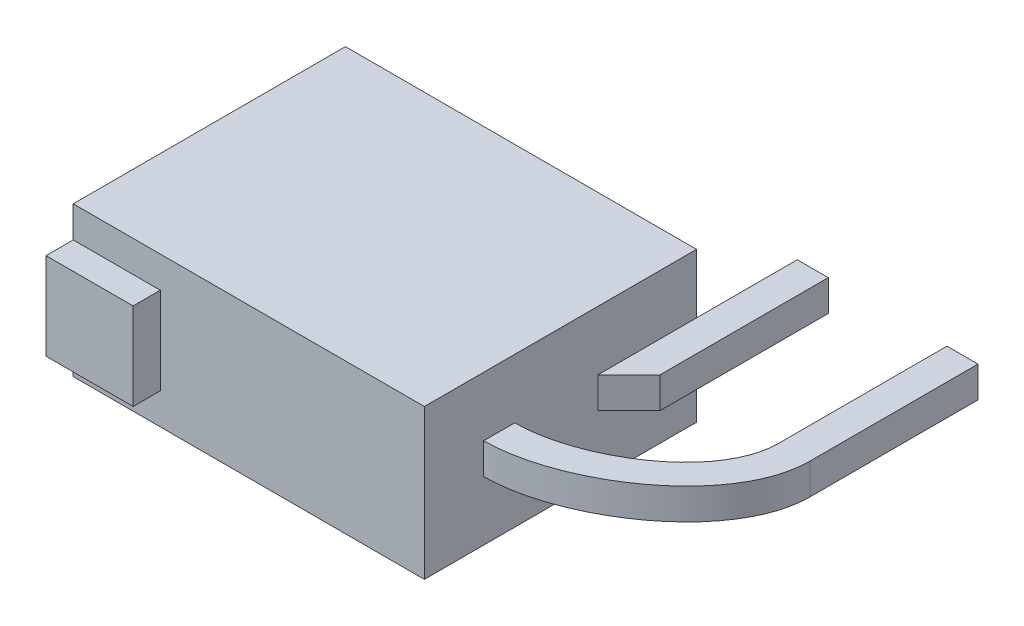
ISO-10303-21;
HEADER;
FILE_DESCRIPTION(('STEP AP214'),'2;1');
FILE_NAME('part.step','',(''),(''),'','','');
FILE_SCHEMA(('AUTOMOTIVE_DESIGN { 1 0 10303 214 1 1 1 1 }'));
ENDSEC;
DATA;
#1=APPLICATION_CONTEXT('core data for automotive mechanical design processes');
#2=APPLICATION_PROTOCOL_DEFINITION('international standard','automotive_design',2000,#1);
#3=PRODUCT_CONTEXT('',#1,'mechanical');
#4=PRODUCT('Part','Part','',(#3));
#5=PRODUCT_RELATED_PRODUCT_CATEGORY('part','',(#4));
#6=PRODUCT_DEFINITION_FORMATION('','',#4);
#7=PRODUCT_DEFINITION_CONTEXT('part definition',#1,'design');
#8=PRODUCT_DEFINITION('design','',#6,#7);
#9=PRODUCT_DEFINITION_SHAPE('','',#8);
#10=(LENGTH_UNIT() NAMED_UNIT(*) SI_UNIT(.MILLI.,.METRE.));
#11=(NAMED_UNIT(*) PLANE_ANGLE_UNIT() SI_UNIT($,.RADIAN.));
#12=(NAMED_UNIT(*) SI_UNIT($,.STERADIAN.) SOLID_ANGLE_UNIT());
#13=UNCERTAINTY_MEASURE_WITH_UNIT(LENGTH_MEASURE(1.E-05),#10,'distance_accuracy_value','');
#14=(GEOMETRIC_REPRESENTATION_CONTEXT(3) GLOBAL_UNCERTAINTY_ASSIGNED_CONTEXT((#13)) GLOBAL_UNIT_ASSIGNED_CONTEXT((#10,
#11,#12)) REPRESENTATION_CONTEXT('',''));
#15=CARTESIAN_POINT('',(0.,0.,0.));
#16=DIRECTION('',(0.,0.,1.));
#17=DIRECTION('',(1.,0.,0.));
#18=AXIS2_PLACEMENT_3D('',#15,#16,#17);
#19=CARTESIAN_POINT('',(14.5122034611053,0.570000000000003,3.62));
#20=DIRECTION('',(0.,0.,1.));
#21=DIRECTION('',(0.,-1.,0.));
#22=AXIS2_PLACEMENT_3D('',#19,#20,#21);
#23=PLANE('',#22);
#24=DIRECTION('',(0.,1.,0.));
#25=VECTOR('',#24,1.);
#26=CARTESIAN_POINT('',(12.9,0.,3.62));
#27=LINE('',#26,#25);
#28=CARTESIAN_POINT('',(12.9,0.570000000000002,3.62));
#29=VERTEX_POINT('',#28);
#30=CARTESIAN_POINT('',(12.9,-0.569999999999998,3.62));
#31=VERTEX_POINT('',#30);
#32=EDGE_CURVE('E13',#29,#31,#27,.F.);
#33=ORIENTED_EDGE('',*,*,#32,.F.);
#34=DIRECTION('',(-1.,0.,0.));
#35=VECTOR('',#34,1.);
#36=CARTESIAN_POINT('',(14.5122034611053,0.570000000000003,3.62));
#37=LINE('',#36,#35);
#38=CARTESIAN_POINT('',(2.,0.57,3.62));
#39=VERTEX_POINT('',#38);
#40=EDGE_CURVE('E164',#29,#39,#37,.T.);
#41=ORIENTED_EDGE('',*,*,#40,.T.);
#42=DIRECTION('',(0.,1.,0.));
#43=VECTOR('',#42,1.);
#44=CARTESIAN_POINT('',(2.,0.57,3.62));
#45=LINE('',#44,#43);
#46=CARTESIAN_POINT('',(2.,-0.57,3.62));
#47=VERTEX_POINT('',#46);
#48=EDGE_CURVE('E221',#47,#39,#45,.T.);
#49=ORIENTED_EDGE('',*,*,#48,.F.);
#50=DIRECTION('',(-1.,0.,0.));
#51=VECTOR('',#50,1.);
#52=CARTESIAN_POINT('',(14.5122034611053,-0.569999999999998,3.62));
#53=LINE('',#52,#51);
#54=EDGE_CURVE('E109',#31,#47,#53,.T.);
#55=ORIENTED_EDGE('',*,*,#54,.F.);
#56=EDGE_LOOP('',(#33,#41,#49,#55));
#57=FACE_BOUND('',#56,.T.);
#58=ADVANCED_FACE('F99',(#57),#23,.T.);
#59=CARTESIAN_POINT('',(14.5122034611053,-0.569999999999998,2.48));
#60=DIRECTION('',(0.,-1.,0.));
#61=DIRECTION('',(1.,0.,0.));
#62=AXIS2_PLACEMENT_3D('',#59,#60,#61);
#63=PLANE('',#62);
#64=DIRECTION('',(-1.,0.,0.));
#65=VECTOR('',#64,1.);
#66=CARTESIAN_POINT('',(14.5122034611053,-0.569999999999998,2.48));
#67=LINE('',#66,#65);
#68=CARTESIAN_POINT('',(12.9,-0.569999999999999,2.48));
#69=VERTEX_POINT('',#68);
#70=CARTESIAN_POINT('',(2.,-0.57,2.48));
#71=VERTEX_POINT('',#70);
#72=EDGE_CURVE('E163',#69,#71,#67,.T.);
#73=ORIENTED_EDGE('',*,*,#72,.F.);
#74=DIRECTION('',(0.,0.,1.));
#75=VECTOR('',#74,1.);
#76=CARTESIAN_POINT('',(12.9,-0.57,-3.7));
#77=LINE('',#76,#75);
#78=CARTESIAN_POINT('',(12.9,-0.57,-3.7));
#79=VERTEX_POINT('',#78);
#80=EDGE_CURVE('E175',#79,#69,#77,.T.);
#81=ORIENTED_EDGE('',*,*,#80,.F.);
#82=DIRECTION('',(1.,0.,0.));
#83=VECTOR('',#82,1.);
#84=CARTESIAN_POINT('',(12.9,-0.57,-3.7));
#85=LINE('',#84,#83);
#86=CARTESIAN_POINT('',(14.04,-0.57,-3.7));
#87=VERTEX_POINT('',#86);
#88=EDGE_CURVE('E198',#79,#87,#85,.T.);
#89=ORIENTED_EDGE('',*,*,#88,.T.);
#90=DIRECTION('',(0.,0.,1.));
#91=VECTOR('',#90,1.);
#92=CARTESIAN_POINT('',(14.04,-0.57,-3.7));
#93=LINE('',#92,#91);
#94=CARTESIAN_POINT('',(14.04,-0.57,2.48));
#95=VERTEX_POINT('',#94);
#96=EDGE_CURVE('E212',#87,#95,#93,.T.);
#97=ORIENTED_EDGE('',*,*,#96,.T.);
#98=DIRECTION('',(0.707106781186547,0.,-0.707106781186548));
#99=VECTOR('',#98,1.);
#100=CARTESIAN_POINT('',(12.9,-0.569999999999998,3.62));
#101=LINE('',#100,#99);
#102=EDGE_CURVE('E211',#31,#95,#101,.T.);
#103=ORIENTED_EDGE('',*,*,#102,.F.);
#104=ORIENTED_EDGE('',*,*,#54,.T.);
#105=DIRECTION('',(0.,0.,1.));
#106=VECTOR('',#105,1.);
#107=CARTESIAN_POINT('',(2.,-0.57,2.48));
#108=LINE('',#107,#106);
#109=EDGE_CURVE('E237',#71,#47,#108,.T.);
#110=ORIENTED_EDGE('',*,*,#109,.F.);
#111=EDGE_LOOP('',(#73,#81,#89,#97,#103,#104,#110));
#112=FACE_BOUND('',#111,.T.);
#113=ADVANCED_FACE('F274',(#112),#63,.T.);
#114=CARTESIAN_POINT('',(14.5122034611053,0.570000000000003,2.48));
#115=DIRECTION('',(0.,0.,-1.));
#116=DIRECTION('',(-1.,0.,0.));
#117=AXIS2_PLACEMENT_3D('',#114,#115,#116);
#118=PLANE('',#117);
#119=DIRECTION('',(0.,1.,0.));
#120=VECTOR('',#119,1.);
#121=CARTESIAN_POINT('',(12.9,-0.57,2.48));
#122=LINE('',#121,#120);
#123=CARTESIAN_POINT('',(12.9,0.57,2.48));
#124=VERTEX_POINT('',#123);
#125=EDGE_CURVE('E116',#69,#124,#122,.T.);
#126=ORIENTED_EDGE('',*,*,#125,.F.);
#127=ORIENTED_EDGE('',*,*,#72,.T.);
#128=DIRECTION('',(0.,-1.,0.));
#129=VECTOR('',#128,1.);
#130=CARTESIAN_POINT('',(2.,0.57,2.48));
#131=LINE('',#130,#129);
#132=CARTESIAN_POINT('',(2.,0.57,2.48));
#133=VERTEX_POINT('',#132);
#134=EDGE_CURVE('E158',#133,#71,#131,.T.);
#135=ORIENTED_EDGE('',*,*,#134,.F.);
#136=DIRECTION('',(-1.,0.,0.));
#137=VECTOR('',#136,1.);
#138=CARTESIAN_POINT('',(14.5122034611053,0.570000000000003,2.48));
#139=LINE('',#138,#137);
#140=EDGE_CURVE('E154',#124,#133,#139,.T.);
#141=ORIENTED_EDGE('',*,*,#140,.F.);
#142=EDGE_LOOP('',(#126,#127,#135,#141));
#143=FACE_BOUND('',#142,.T.);
#144=ADVANCED_FACE('F156',(#143),#118,.T.);
#145=CARTESIAN_POINT('',(14.5122034611053,0.570000000000003,2.48));
#146=DIRECTION('',(0.,1.,0.));
#147=DIRECTION('',(-1.,0.,0.));
#148=AXIS2_PLACEMENT_3D('',#145,#146,#147);
#149=PLANE('',#148);
#150=ORIENTED_EDGE('',*,*,#40,.F.);
#151=DIRECTION('',(0.707106781186548,0.,-0.707106781186547));
#152=VECTOR('',#151,1.);
#153=CARTESIAN_POINT('',(13.47,0.570000000000001,3.05));
#154=LINE('',#153,#152);
#155=CARTESIAN_POINT('',(14.04,0.57,2.48));
#156=VERTEX_POINT('',#155);
#157=EDGE_CURVE('E207',#29,#156,#154,.T.);
#158=ORIENTED_EDGE('',*,*,#157,.T.);
#159=DIRECTION('',(0.,0.,1.));
#160=VECTOR('',#159,1.);
#161=CARTESIAN_POINT('',(14.04,0.57,-3.7));
#162=LINE('',#161,#160);
#163=CARTESIAN_POINT('',(14.04,0.57,-3.7));
#164=VERTEX_POINT('',#163);
#165=EDGE_CURVE('E176',#164,#156,#162,.T.);
#166=ORIENTED_EDGE('',*,*,#165,.F.);
#167=DIRECTION('',(-1.,0.,0.));
#168=VECTOR('',#167,1.);
#169=CARTESIAN_POINT('',(12.9,0.57,-3.7));
#170=LINE('',#169,#168);
#171=CARTESIAN_POINT('',(12.9,0.57,-3.7));
#172=VERTEX_POINT('',#171);
#173=EDGE_CURVE('E170',#164,#172,#170,.T.);
#174=ORIENTED_EDGE('',*,*,#173,.T.);
#175=DIRECTION('',(0.,0.,1.));
#176=VECTOR('',#175,1.);
#177=CARTESIAN_POINT('',(12.9,0.57,-3.7));
#178=LINE('',#177,#176);
#179=EDGE_CURVE('E167',#172,#124,#178,.T.);
#180=ORIENTED_EDGE('',*,*,#179,.T.);
#181=ORIENTED_EDGE('',*,*,#140,.T.);
#182=DIRECTION('',(0.,0.,-1.));
#183=VECTOR('',#182,1.);
#184=CARTESIAN_POINT('',(2.,0.57,2.48));
#185=LINE('',#184,#183);
#186=EDGE_CURVE('E232',#39,#133,#185,.T.);
#187=ORIENTED_EDGE('',*,*,#186,.F.);
#188=EDGE_LOOP('',(#150,#158,#166,#174,#180,#181,#187));
#189=FACE_BOUND('',#188,.T.);
#190=ADVANCED_FACE('F168',(#189),#149,.T.);
#191=CARTESIAN_POINT('',(2.,0.,-4.2));
#192=DIRECTION('',(-1.,0.,0.));
#193=DIRECTION('',(0.,0.,1.));
#194=AXIS2_PLACEMENT_3D('',#191,#192,#193);
#195=PLANE('',#194);
#196=ORIENTED_EDGE('',*,*,#48,.T.);
#197=ORIENTED_EDGE('',*,*,#186,.T.);
#198=ORIENTED_EDGE('',*,*,#134,.T.);
#199=ORIENTED_EDGE('',*,*,#109,.T.);
#200=EDGE_LOOP('',(#196,#197,#198,#199));
#201=FACE_BOUND('',#200,.T.);
#202=ADVANCED_FACE('F271',(#201),#195,.T.);
#203=CARTESIAN_POINT('',(8.26000000000001,0.,8.26));
#204=DIRECTION('',(-0.707106781186548,0.,-0.707106781186547));
#205=DIRECTION('',(-0.707106781186547,0.,0.707106781186548));
#206=AXIS2_PLACEMENT_3D('',#203,#204,#205);
#207=PLANE('',#206);
#208=ORIENTED_EDGE('',*,*,#102,.T.);
#209=DIRECTION('',(0.,-1.,0.));
#210=VECTOR('',#209,1.);
#211=CARTESIAN_POINT('',(14.04,-0.57,2.48));
#212=LINE('',#211,#210);
#213=EDGE_CURVE('E217',#156,#95,#212,.T.);
#214=ORIENTED_EDGE('',*,*,#213,.F.);
#215=ORIENTED_EDGE('',*,*,#157,.F.);
#216=ORIENTED_EDGE('',*,*,#32,.T.);
#217=EDGE_LOOP('',(#208,#214,#215,#216));
#218=FACE_BOUND('',#217,.T.);
#219=ADVANCED_FACE('F289',(#218),#207,.F.);
#220=CARTESIAN_POINT('',(14.04,-0.57,-3.7));
#221=DIRECTION('',(1.,0.,0.));
#222=DIRECTION('',(0.,0.,-1.));
#223=AXIS2_PLACEMENT_3D('',#220,#221,#222);
#224=PLANE('',#223);
#225=ORIENTED_EDGE('',*,*,#165,.T.);
#226=ORIENTED_EDGE('',*,*,#213,.T.);
#227=ORIENTED_EDGE('',*,*,#96,.F.);
#228=DIRECTION('',(0.,1.,0.));
#229=VECTOR('',#228,1.);
#230=CARTESIAN_POINT('',(14.04,-0.57,-3.7));
#231=LINE('',#230,#229);
#232=EDGE_CURVE('E181',#87,#164,#231,.T.);
#233=ORIENTED_EDGE('',*,*,#232,.T.);
#234=EDGE_LOOP('',(#225,#226,#227,#233));
#235=FACE_BOUND('',#234,.T.);
#236=ADVANCED_FACE('F293',(#235),#224,.T.);
#237=CARTESIAN_POINT('',(12.9,-0.57,-3.7));
#238=DIRECTION('',(-1.,0.,0.));
#239=DIRECTION('',(0.,0.,1.));
#240=AXIS2_PLACEMENT_3D('',#237,#238,#239);
#241=PLANE('',#240);
#242=ORIENTED_EDGE('',*,*,#80,.T.);
#243=ORIENTED_EDGE('',*,*,#125,.T.);
#244=ORIENTED_EDGE('',*,*,#179,.F.);
#245=DIRECTION('',(0.,-1.,0.));
#246=VECTOR('',#245,1.);
#247=CARTESIAN_POINT('',(12.9,-0.57,-3.7));
#248=LINE('',#247,#246);
#249=EDGE_CURVE('E195',#172,#79,#248,.T.);
#250=ORIENTED_EDGE('',*,*,#249,.T.);
#251=EDGE_LOOP('',(#242,#243,#244,#250));
#252=FACE_BOUND('',#251,.T.);
#253=ADVANCED_FACE('F179',(#252),#241,.T.);
#254=CARTESIAN_POINT('',(0.,0.,-3.7));
#255=DIRECTION('',(0.,0.,-1.));
#256=DIRECTION('',(-1.,0.,0.));
#257=AXIS2_PLACEMENT_3D('',#254,#255,#256);
#258=PLANE('',#257);
#259=ORIENTED_EDGE('',*,*,#232,.F.);
#260=ORIENTED_EDGE('',*,*,#88,.F.);
#261=ORIENTED_EDGE('',*,*,#249,.F.);
#262=ORIENTED_EDGE('',*,*,#173,.F.);
#263=EDGE_LOOP('',(#259,#260,#261,#262));
#264=FACE_BOUND('',#263,.T.);
#265=ADVANCED_FACE('F332',(#264),#258,.T.);
#266=CLOSED_SHELL('',(#58,#113,#144,#190,#202,#219,#236,#253,#265));
#267=MANIFOLD_SOLID_BREP('B2',#266);
#268=CARTESIAN_POINT('',(14.5122034611053,0.570000000000003,7.82));
#269=DIRECTION('',(0.,0.,1.));
#270=DIRECTION('',(0.,-1.,0.));
#271=AXIS2_PLACEMENT_3D('',#268,#269,#270);
#272=PLANE('',#271);
#273=DIRECTION('',(0.,-1.,0.));
#274=VECTOR('',#273,1.);
#275=CARTESIAN_POINT('',(12.9,0.570000000000003,7.82));
#276=LINE('',#275,#274);
#277=CARTESIAN_POINT('',(12.9,0.570000000000003,7.82));
#278=VERTEX_POINT('',#277);
#279=CARTESIAN_POINT('',(12.9,-0.569999999999997,7.82));
#280=VERTEX_POINT('',#279);
#281=EDGE_CURVE('E97',#278,#280,#276,.T.);
#282=ORIENTED_EDGE('',*,*,#281,.F.);
#283=DIRECTION('',(-1.,0.,0.));
#284=VECTOR('',#283,1.);
#285=CARTESIAN_POINT('',(14.5122034611053,0.570000000000003,7.82));
#286=LINE('',#285,#284);
#287=CARTESIAN_POINT('',(2.,0.57,7.82));
#288=VERTEX_POINT('',#287);
#289=EDGE_CURVE('E611',#278,#288,#286,.T.);
#290=ORIENTED_EDGE('',*,*,#289,.T.);
#291=DIRECTION('',(0.,1.,0.));
#292=VECTOR('',#291,1.);
#293=CARTESIAN_POINT('',(2.,0.57,7.82));
#294=LINE('',#293,#292);
#295=CARTESIAN_POINT('',(2.,-0.57,7.82));
#296=VERTEX_POINT('',#295);
#297=EDGE_CURVE('E589',#296,#288,#294,.T.);
#298=ORIENTED_EDGE('',*,*,#297,.F.);
#299=DIRECTION('',(-1.,0.,0.));
#300=VECTOR('',#299,1.);
#301=CARTESIAN_POINT('',(14.5122034611053,-0.569999999999998,7.82));
#302=LINE('',#301,#300);
#303=EDGE_CURVE('E620',#280,#296,#302,.T.);
#304=ORIENTED_EDGE('',*,*,#303,.F.);
#305=EDGE_LOOP('',(#282,#290,#298,#304));
#306=FACE_BOUND('',#305,.T.);
#307=ADVANCED_FACE('F455',(#306),#272,.T.);
#308=CARTESIAN_POINT('',(14.5122034611053,-0.569999999999998,6.68));
#309=DIRECTION('',(0.,-1.,0.));
#310=DIRECTION('',(1.,0.,0.));
#311=AXIS2_PLACEMENT_3D('',#308,#309,#310);
#312=PLANE('',#311);
#313=DIRECTION('',(-1.,0.,0.));
#314=VECTOR('',#313,1.);
#315=CARTESIAN_POINT('',(14.5122034611053,-0.569999999999998,6.68));
#316=LINE('',#315,#314);
#317=CARTESIAN_POINT('',(12.9,-0.569999999999997,6.68));
#318=VERTEX_POINT('',#317);
#319=CARTESIAN_POINT('',(2.,-0.57,6.68));
#320=VERTEX_POINT('',#319);
#321=EDGE_CURVE('E617',#318,#320,#316,.T.);
#322=ORIENTED_EDGE('',*,*,#321,.F.);
#323=CARTESIAN_POINT('',(12.9,-0.569999999999998,6.68));
#324=CARTESIAN_POINT('',(15.2067533702395,-0.569999999999997,6.68));
#325=CARTESIAN_POINT('',(18.4,-0.570000000000002,4.78675337023946));
#326=CARTESIAN_POINT('',(18.4,-0.570000000000002,2.48));
#327=B_SPLINE_CURVE_WITH_KNOTS('',3,(#323,#324,#325,#326),.UNSPECIFIED.,.F.,.F.,(4,4),(0.,1.),.UNSPECIFIED.);
#328=CARTESIAN_POINT('',(18.4,-0.570000000000002,2.48));
#329=VERTEX_POINT('',#328);
#330=EDGE_CURVE('E527',#318,#329,#327,.T.);
#331=ORIENTED_EDGE('',*,*,#330,.T.);
#332=DIRECTION('',(0.,0.,1.));
#333=VECTOR('',#332,1.);
#334=CARTESIAN_POINT('',(18.4,-0.570000000000002,-3.7));
#335=LINE('',#334,#333);
#336=CARTESIAN_POINT('',(18.4,-0.570000000000002,-3.7));
#337=VERTEX_POINT('',#336);
#338=EDGE_CURVE('E538',#337,#329,#335,.T.);
#339=ORIENTED_EDGE('',*,*,#338,.F.);
#340=DIRECTION('',(1.,0.,0.));
#341=VECTOR('',#340,1.);
#342=CARTESIAN_POINT('',(18.4,-0.570000000000002,-3.7));
#343=LINE('',#342,#341);
#344=CARTESIAN_POINT('',(19.54,-0.570000000000002,-3.7));
#345=VERTEX_POINT('',#344);
#346=EDGE_CURVE('E626',#337,#345,#343,.T.);
#347=ORIENTED_EDGE('',*,*,#346,.T.);
#348=DIRECTION('',(0.,0.,1.));
#349=VECTOR('',#348,1.);
#350=CARTESIAN_POINT('',(19.54,-0.570000000000002,-3.7));
#351=LINE('',#350,#349);
#352=CARTESIAN_POINT('',(19.54,-0.570000000000002,2.48));
#353=VERTEX_POINT('',#352);
#354=EDGE_CURVE('E632',#345,#353,#351,.T.);
#355=ORIENTED_EDGE('',*,*,#354,.T.);
#356=CARTESIAN_POINT('',(12.9,-0.569999999999998,7.82));
#357=CARTESIAN_POINT('',(15.7402895001116,-0.569999999999997,7.82));
#358=CARTESIAN_POINT('',(19.54,-0.570000000000002,5.32028950011164));
#359=CARTESIAN_POINT('',(19.54,-0.570000000000002,2.48));
#360=B_SPLINE_CURVE_WITH_KNOTS('',3,(#356,#357,#358,#359),.UNSPECIFIED.,.F.,.F.,(4,4),(0.,1.),.UNSPECIFIED.);
#361=EDGE_CURVE('E634',#353,#280,#360,.F.);
#362=ORIENTED_EDGE('',*,*,#361,.T.);
#363=ORIENTED_EDGE('',*,*,#303,.T.);
#364=DIRECTION('',(0.,0.,1.));
#365=VECTOR('',#364,1.);
#366=CARTESIAN_POINT('',(2.,-0.57,6.68));
#367=LINE('',#366,#365);
#368=EDGE_CURVE('E607',#320,#296,#367,.T.);
#369=ORIENTED_EDGE('',*,*,#368,.F.);
#370=EDGE_LOOP('',(#322,#331,#339,#347,#355,#362,#363,#369));
#371=FACE_BOUND('',#370,.T.);
#372=ADVANCED_FACE('F690',(#371),#312,.T.);
#373=CARTESIAN_POINT('',(14.5122034611053,0.570000000000003,6.68));
#374=DIRECTION('',(0.,0.,-1.));
#375=DIRECTION('',(-1.,0.,0.));
#376=AXIS2_PLACEMENT_3D('',#373,#374,#375);
#377=PLANE('',#376);
#378=DIRECTION('',(0.,1.,0.));
#379=VECTOR('',#378,1.);
#380=CARTESIAN_POINT('',(12.9,0.570000000000003,6.68));
#381=LINE('',#380,#379);
#382=CARTESIAN_POINT('',(12.9,0.570000000000003,6.68));
#383=VERTEX_POINT('',#382);
#384=EDGE_CURVE('E465',#318,#383,#381,.T.);
#385=ORIENTED_EDGE('',*,*,#384,.F.);
#386=ORIENTED_EDGE('',*,*,#321,.T.);
#387=DIRECTION('',(0.,-1.,0.));
#388=VECTOR('',#387,1.);
#389=CARTESIAN_POINT('',(2.,0.57,6.68));
#390=LINE('',#389,#388);
#391=CARTESIAN_POINT('',(2.,0.57,6.68));
#392=VERTEX_POINT('',#391);
#393=EDGE_CURVE('E603',#392,#320,#390,.T.);
#394=ORIENTED_EDGE('',*,*,#393,.F.);
#395=DIRECTION('',(-1.,0.,0.));
#396=VECTOR('',#395,1.);
#397=CARTESIAN_POINT('',(14.5122034611053,0.570000000000003,6.68));
#398=LINE('',#397,#396);
#399=EDGE_CURVE('E614',#383,#392,#398,.T.);
#400=ORIENTED_EDGE('',*,*,#399,.F.);
#401=EDGE_LOOP('',(#385,#386,#394,#400));
#402=FACE_BOUND('',#401,.T.);
#403=ADVANCED_FACE('F693',(#402),#377,.T.);
#404=CARTESIAN_POINT('',(14.5122034611053,0.570000000000003,6.68));
#405=DIRECTION('',(0.,1.,0.));
#406=DIRECTION('',(-1.,0.,0.));
#407=AXIS2_PLACEMENT_3D('',#404,#405,#406);
#408=PLANE('',#407);
#409=ORIENTED_EDGE('',*,*,#289,.F.);
#410=CARTESIAN_POINT('',(12.9,0.570000000000002,7.82));
#411=CARTESIAN_POINT('',(15.7402895001116,0.570000000000003,7.82));
#412=CARTESIAN_POINT('',(19.54,0.569999999999998,5.32028950011164));
#413=CARTESIAN_POINT('',(19.54,0.569999999999998,2.48));
#414=B_SPLINE_CURVE_WITH_KNOTS('',3,(#410,#411,#412,#413),.UNSPECIFIED.,.F.,.F.,(4,4),(0.,1.),.UNSPECIFIED.);
#415=CARTESIAN_POINT('',(19.54,0.569999999999998,2.48));
#416=VERTEX_POINT('',#415);
#417=EDGE_CURVE('E526',#278,#416,#414,.T.);
#418=ORIENTED_EDGE('',*,*,#417,.T.);
#419=DIRECTION('',(0.,0.,1.));
#420=VECTOR('',#419,1.);
#421=CARTESIAN_POINT('',(19.54,0.569999999999998,-3.7));
#422=LINE('',#421,#420);
#423=CARTESIAN_POINT('',(19.54,0.569999999999998,-3.7));
#424=VERTEX_POINT('',#423);
#425=EDGE_CURVE('E539',#424,#416,#422,.T.);
#426=ORIENTED_EDGE('',*,*,#425,.F.);
#427=DIRECTION('',(-1.,0.,0.));
#428=VECTOR('',#427,1.);
#429=CARTESIAN_POINT('',(18.4,0.569999999999998,-3.7));
#430=LINE('',#429,#428);
#431=CARTESIAN_POINT('',(18.4,0.569999999999998,-3.7));
#432=VERTEX_POINT('',#431);
#433=EDGE_CURVE('E533',#424,#432,#430,.T.);
#434=ORIENTED_EDGE('',*,*,#433,.T.);
#435=DIRECTION('',(0.,0.,1.));
#436=VECTOR('',#435,1.);
#437=CARTESIAN_POINT('',(18.4,0.569999999999998,-3.7));
#438=LINE('',#437,#436);
#439=CARTESIAN_POINT('',(18.4,0.569999999999998,2.48));
#440=VERTEX_POINT('',#439);
#441=EDGE_CURVE('E530',#432,#440,#438,.T.);
#442=ORIENTED_EDGE('',*,*,#441,.T.);
#443=CARTESIAN_POINT('',(12.9,0.570000000000002,6.68));
#444=CARTESIAN_POINT('',(15.2067533702395,0.570000000000003,6.68));
#445=CARTESIAN_POINT('',(18.4,0.569999999999998,4.78675337023946));
#446=CARTESIAN_POINT('',(18.4,0.569999999999998,2.48));
#447=B_SPLINE_CURVE_WITH_KNOTS('',3,(#443,#444,#445,#446),.UNSPECIFIED.,.F.,.F.,(4,4),(0.,1.),.UNSPECIFIED.);
#448=EDGE_CURVE('E516',#383,#440,#447,.T.);
#449=ORIENTED_EDGE('',*,*,#448,.F.);
#450=ORIENTED_EDGE('',*,*,#399,.T.);
#451=DIRECTION('',(0.,0.,-1.));
#452=VECTOR('',#451,1.);
#453=CARTESIAN_POINT('',(2.,0.57,6.68));
#454=LINE('',#453,#452);
#455=EDGE_CURVE('E599',#288,#392,#454,.T.);
#456=ORIENTED_EDGE('',*,*,#455,.F.);
#457=EDGE_LOOP('',(#409,#418,#426,#434,#442,#449,#450,#456));
#458=FACE_BOUND('',#457,.T.);
#459=ADVANCED_FACE('F531',(#458),#408,.T.);
#460=CARTESIAN_POINT('',(2.,0.,0.));
#461=DIRECTION('',(-1.,0.,0.));
#462=DIRECTION('',(0.,0.,1.));
#463=AXIS2_PLACEMENT_3D('',#460,#461,#462);
#464=PLANE('',#463);
#465=ORIENTED_EDGE('',*,*,#297,.T.);
#466=ORIENTED_EDGE('',*,*,#455,.T.);
#467=ORIENTED_EDGE('',*,*,#393,.T.);
#468=ORIENTED_EDGE('',*,*,#368,.T.);
#469=EDGE_LOOP('',(#465,#466,#467,#468));
#470=FACE_BOUND('',#469,.T.);
#471=ADVANCED_FACE('F681',(#470),#464,.T.);
#472=CARTESIAN_POINT('',(12.9,-0.569999999999999,6.68));
#473=CARTESIAN_POINT('',(15.2067533702395,-0.569999999999998,6.68));
#474=CARTESIAN_POINT('',(18.4,-0.570000000000002,4.78675337023946));
#475=CARTESIAN_POINT('',(18.4,-0.570000000000002,2.48));
#476=CARTESIAN_POINT('',(12.9,-0.189999999999998,6.68));
#477=CARTESIAN_POINT('',(15.2067533702395,-0.189999999999998,6.68));
#478=CARTESIAN_POINT('',(18.4,-0.190000000000002,4.78675337023946));
#479=CARTESIAN_POINT('',(18.4,-0.190000000000002,2.48));
#480=CARTESIAN_POINT('',(12.9,0.190000000000002,6.68));
#481=CARTESIAN_POINT('',(15.2067533702395,0.190000000000003,6.68));
#482=CARTESIAN_POINT('',(18.4,0.189999999999998,4.78675337023946));
#483=CARTESIAN_POINT('',(18.4,0.189999999999998,2.48));
#484=CARTESIAN_POINT('',(12.9,0.570000000000002,6.68));
#485=CARTESIAN_POINT('',(15.2067533702395,0.570000000000003,6.68));
#486=CARTESIAN_POINT('',(18.4,0.569999999999998,4.78675337023946));
#487=CARTESIAN_POINT('',(18.4,0.569999999999998,2.48));
#488=B_SPLINE_SURFACE_WITH_KNOTS('',3,3,((#472,#473,#474,#475),(#476,#477,#478,#479),(#480,#481,
#482,#483),(#484,#485,#486,#487)),.UNSPECIFIED.,.F.,.F.,.F.,(4,4),(4,4),(0.,1.),(0.,1.),.UNSPECIFIED.);
#489=DIRECTION('',(0.,1.,0.));
#490=VECTOR('',#489,1.);
#491=CARTESIAN_POINT('',(18.4,-0.570000000000002,2.48));
#492=LINE('',#491,#490);
#493=EDGE_CURVE('E521',#329,#440,#492,.T.);
#494=ORIENTED_EDGE('',*,*,#384,.T.);
#495=ORIENTED_EDGE('',*,*,#448,.T.);
#496=ORIENTED_EDGE('',*,*,#493,.F.);
#497=ORIENTED_EDGE('',*,*,#330,.F.);
#498=EDGE_LOOP('',(#494,#495,#496,#497));
#499=FACE_BOUND('',#498,.T.);
#500=ADVANCED_FACE('F518',(#499),#488,.T.);
#501=CARTESIAN_POINT('',(12.9,0.570000000000002,7.82));
#502=CARTESIAN_POINT('',(15.7402895001116,0.570000000000003,7.82));
#503=CARTESIAN_POINT('',(19.54,0.569999999999998,5.32028950011164));
#504=CARTESIAN_POINT('',(19.54,0.569999999999998,2.48));
#505=CARTESIAN_POINT('',(12.9,0.190000000000002,7.82));
#506=CARTESIAN_POINT('',(15.7402895001116,0.190000000000003,7.82));
#507=CARTESIAN_POINT('',(19.54,0.189999999999998,5.32028950011164));
#508=CARTESIAN_POINT('',(19.54,0.189999999999998,2.48));
#509=CARTESIAN_POINT('',(12.9,-0.189999999999998,7.82));
#510=CARTESIAN_POINT('',(15.7402895001116,-0.189999999999997,7.82));
#511=CARTESIAN_POINT('',(19.54,-0.190000000000002,5.32028950011164));
#512=CARTESIAN_POINT('',(19.54,-0.190000000000002,2.48));
#513=CARTESIAN_POINT('',(12.9,-0.569999999999998,7.82));
#514=CARTESIAN_POINT('',(15.7402895001116,-0.569999999999997,7.82));
#515=CARTESIAN_POINT('',(19.54,-0.570000000000002,5.32028950011164));
#516=CARTESIAN_POINT('',(19.54,-0.570000000000002,2.48));
#517=B_SPLINE_SURFACE_WITH_KNOTS('',3,3,((#501,#502,#503,#504),(#505,#506,#507,#508),(#509,#510,
#511,#512),(#513,#514,#515,#516)),.UNSPECIFIED.,.F.,.F.,.F.,(4,4),(4,4),(0.,1.),(0.,1.),.UNSPECIFIED.);
#518=DIRECTION('',(0.,-1.,0.));
#519=VECTOR('',#518,1.);
#520=CARTESIAN_POINT('',(19.54,-0.570000000000002,2.48));
#521=LINE('',#520,#519);
#522=EDGE_CURVE('E545',#416,#353,#521,.T.);
#523=ORIENTED_EDGE('',*,*,#281,.T.);
#524=ORIENTED_EDGE('',*,*,#361,.F.);
#525=ORIENTED_EDGE('',*,*,#522,.F.);
#526=ORIENTED_EDGE('',*,*,#417,.F.);
#527=EDGE_LOOP('',(#523,#524,#525,#526));
#528=FACE_BOUND('',#527,.T.);
#529=ADVANCED_FACE('F569',(#528),#517,.T.);
#530=CARTESIAN_POINT('',(19.54,-0.570000000000002,-3.7));
#531=DIRECTION('',(1.,0.,0.));
#532=DIRECTION('',(0.,0.,-1.));
#533=AXIS2_PLACEMENT_3D('',#530,#531,#532);
#534=PLANE('',#533);
#535=ORIENTED_EDGE('',*,*,#425,.T.);
#536=ORIENTED_EDGE('',*,*,#522,.T.);
#537=ORIENTED_EDGE('',*,*,#354,.F.);
#538=DIRECTION('',(0.,1.,0.));
#539=VECTOR('',#538,1.);
#540=CARTESIAN_POINT('',(19.54,-0.570000000000002,-3.7));
#541=LINE('',#540,#539);
#542=EDGE_CURVE('E630',#345,#424,#541,.T.);
#543=ORIENTED_EDGE('',*,*,#542,.T.);
#544=EDGE_LOOP('',(#535,#536,#537,#543));
#545=FACE_BOUND('',#544,.T.);
#546=ADVANCED_FACE('F565',(#545),#534,.T.);
#547=CARTESIAN_POINT('',(18.4,-0.570000000000002,-3.7));
#548=DIRECTION('',(-1.,0.,0.));
#549=DIRECTION('',(0.,0.,1.));
#550=AXIS2_PLACEMENT_3D('',#547,#548,#549);
#551=PLANE('',#550);
#552=ORIENTED_EDGE('',*,*,#338,.T.);
#553=ORIENTED_EDGE('',*,*,#493,.T.);
#554=ORIENTED_EDGE('',*,*,#441,.F.);
#555=DIRECTION('',(0.,-1.,0.));
#556=VECTOR('',#555,1.);
#557=CARTESIAN_POINT('',(18.4,-0.570000000000002,-3.7));
#558=LINE('',#557,#556);
#559=EDGE_CURVE('E625',#432,#337,#558,.T.);
#560=ORIENTED_EDGE('',*,*,#559,.T.);
#561=EDGE_LOOP('',(#552,#553,#554,#560));
#562=FACE_BOUND('',#561,.T.);
#563=ADVANCED_FACE('F543',(#562),#551,.T.);
#564=CARTESIAN_POINT('',(0.,0.,-3.7));
#565=DIRECTION('',(0.,0.,-1.));
#566=DIRECTION('',(-1.,0.,0.));
#567=AXIS2_PLACEMENT_3D('',#564,#565,#566);
#568=PLANE('',#567);
#569=ORIENTED_EDGE('',*,*,#542,.F.);
#570=ORIENTED_EDGE('',*,*,#346,.F.);
#571=ORIENTED_EDGE('',*,*,#559,.F.);
#572=ORIENTED_EDGE('',*,*,#433,.F.);
#573=EDGE_LOOP('',(#569,#570,#571,#572));
#574=FACE_BOUND('',#573,.T.);
#575=ADVANCED_FACE('F564',(#574),#568,.T.);
#576=CLOSED_SHELL('',(#307,#372,#403,#459,#471,#500,#529,#546,#563,#575));
#577=MANIFOLD_SOLID_BREP('B7',#576);
#578=CARTESIAN_POINT('',(0.,0.,10.));
#579=DIRECTION('',(0.,0.,-1.));
#580=DIRECTION('',(-1.,0.,0.));
#581=AXIS2_PLACEMENT_3D('',#578,#579,#580);
#582=PLANE('',#581);
#583=DIRECTION('',(-1.,0.,0.));
#584=VECTOR('',#583,1.);
#585=CARTESIAN_POINT('',(3.2,1.6,10.));
#586=LINE('',#585,#584);
#587=CARTESIAN_POINT('',(3.2,1.6,10.));
#588=VERTEX_POINT('',#587);
#589=CARTESIAN_POINT('',(0.,1.6,10.));
#590=VERTEX_POINT('',#589);
#591=EDGE_CURVE('E838',#588,#590,#586,.T.);
#592=ORIENTED_EDGE('',*,*,#591,.F.);
#593=DIRECTION('',(0.,1.,0.));
#594=VECTOR('',#593,1.);
#595=CARTESIAN_POINT('',(3.2,-1.6,10.));
#596=LINE('',#595,#594);
#597=CARTESIAN_POINT('',(3.2,-1.6,10.));
#598=VERTEX_POINT('',#597);
#599=EDGE_CURVE('E1111',#598,#588,#596,.T.);
#600=ORIENTED_EDGE('',*,*,#599,.F.);
#601=DIRECTION('',(1.,0.,0.));
#602=VECTOR('',#601,1.);
#603=CARTESIAN_POINT('',(3.2,-1.6,10.));
#604=LINE('',#603,#602);
#605=CARTESIAN_POINT('',(0.,-1.6,10.));
#606=VERTEX_POINT('',#605);
#607=EDGE_CURVE('E844',#606,#598,#604,.T.);
#608=ORIENTED_EDGE('',*,*,#607,.F.);
#609=DIRECTION('',(0.,-1.,0.));
#610=VECTOR('',#609,1.);
#611=CARTESIAN_POINT('',(0.,-2.75,10.));
#612=LINE('',#611,#610);
#613=CARTESIAN_POINT('',(0.,-2.75,10.));
#614=VERTEX_POINT('',#613);
#615=EDGE_CURVE('E959',#606,#614,#612,.T.);
#616=ORIENTED_EDGE('',*,*,#615,.T.);
#617=DIRECTION('',(1.,0.,0.));
#618=VECTOR('',#617,1.);
#619=CARTESIAN_POINT('',(0.,-2.75,10.));
#620=LINE('',#619,#618);
#621=CARTESIAN_POINT('',(12.9,-2.75,10.));
#622=VERTEX_POINT('',#621);
#623=EDGE_CURVE('E1060',#614,#622,#620,.T.);
#624=ORIENTED_EDGE('',*,*,#623,.T.);
#625=DIRECTION('',(0.,1.,0.));
#626=VECTOR('',#625,1.);
#627=CARTESIAN_POINT('',(12.9,-2.75,10.));
#628=LINE('',#627,#626);
#629=CARTESIAN_POINT('',(12.9,2.75,10.));
#630=VERTEX_POINT('',#629);
#631=EDGE_CURVE('E1063',#622,#630,#628,.T.);
#632=ORIENTED_EDGE('',*,*,#631,.T.);
#633=DIRECTION('',(-1.,0.,0.));
#634=VECTOR('',#633,1.);
#635=CARTESIAN_POINT('',(0.,2.75,10.));
#636=LINE('',#635,#634);
#637=CARTESIAN_POINT('',(0.,2.75,10.));
#638=VERTEX_POINT('',#637);
#639=EDGE_CURVE('E1066',#630,#638,#636,.T.);
#640=ORIENTED_EDGE('',*,*,#639,.T.);
#641=EDGE_CURVE('E1057',#638,#590,#612,.T.);
#642=ORIENTED_EDGE('',*,*,#641,.T.);
#643=EDGE_LOOP('',(#592,#600,#608,#616,#624,#632,#640,#642));
#644=FACE_BOUND('',#643,.T.);
#645=ADVANCED_FACE('F822',(#644),#582,.F.);
#646=CARTESIAN_POINT('',(0.,-2.75,10.));
#647=DIRECTION('',(1.,0.,0.));
#648=DIRECTION('',(0.,1.,0.));
#649=AXIS2_PLACEMENT_3D('',#646,#647,#648);
#650=PLANE('',#649);
#651=DIRECTION('',(0.,0.,1.));
#652=VECTOR('',#651,1.);
#653=CARTESIAN_POINT('',(0.,-1.9,1.15));
#654=LINE('',#653,#652);
#655=CARTESIAN_POINT('',(0.,-1.9,1.15));
#656=VERTEX_POINT('',#655);
#657=CARTESIAN_POINT('',(0.,-1.9,4.95));
#658=VERTEX_POINT('',#657);
#659=EDGE_CURVE('E965',#656,#658,#654,.T.);
#660=ORIENTED_EDGE('',*,*,#659,.F.);
#661=DIRECTION('',(0.,-1.,0.));
#662=VECTOR('',#661,1.);
#663=CARTESIAN_POINT('',(0.,1.9,1.15));
#664=LINE('',#663,#662);
#665=CARTESIAN_POINT('',(0.,1.9,1.15));
#666=VERTEX_POINT('',#665);
#667=EDGE_CURVE('E961',#666,#656,#664,.T.);
#668=ORIENTED_EDGE('',*,*,#667,.F.);
#669=DIRECTION('',(0.,0.,-1.));
#670=VECTOR('',#669,1.);
#671=CARTESIAN_POINT('',(0.,1.9,1.15));
#672=LINE('',#671,#670);
#673=CARTESIAN_POINT('',(0.,1.9,4.95));
#674=VERTEX_POINT('',#673);
#675=EDGE_CURVE('E977',#674,#666,#672,.T.);
#676=ORIENTED_EDGE('',*,*,#675,.F.);
#677=DIRECTION('',(0.,1.,0.));
#678=VECTOR('',#677,1.);
#679=CARTESIAN_POINT('',(0.,1.9,4.95));
#680=LINE('',#679,#678);
#681=EDGE_CURVE('E993',#658,#674,#680,.T.);
#682=ORIENTED_EDGE('',*,*,#681,.F.);
#683=EDGE_LOOP('',(#660,#668,#676,#682));
#684=FACE_BOUND('',#683,.T.);
#685=DIRECTION('',(0.,0.,1.));
#686=VECTOR('',#685,1.);
#687=CARTESIAN_POINT('',(0.,-1.9,5.35));
#688=LINE('',#687,#686);
#689=CARTESIAN_POINT('',(0.,-1.9,5.35));
#690=VERTEX_POINT('',#689);
#691=CARTESIAN_POINT('',(0.,-1.9,9.15));
#692=VERTEX_POINT('',#691);
#693=EDGE_CURVE('E1033',#690,#692,#688,.T.);
#694=ORIENTED_EDGE('',*,*,#693,.F.);
#695=DIRECTION('',(0.,-1.,0.));
#696=VECTOR('',#695,1.);
#697=CARTESIAN_POINT('',(0.,1.9,5.35));
#698=LINE('',#697,#696);
#699=CARTESIAN_POINT('',(0.,1.9,5.35));
#700=VERTEX_POINT('',#699);
#701=EDGE_CURVE('E1003',#700,#690,#698,.T.);
#702=ORIENTED_EDGE('',*,*,#701,.F.);
#703=DIRECTION('',(0.,0.,-1.));
#704=VECTOR('',#703,1.);
#705=CARTESIAN_POINT('',(0.,1.9,5.35));
#706=LINE('',#705,#704);
#707=CARTESIAN_POINT('',(0.,1.9,9.15));
#708=VERTEX_POINT('',#707);
#709=EDGE_CURVE('E1018',#708,#700,#706,.T.);
#710=ORIENTED_EDGE('',*,*,#709,.F.);
#711=DIRECTION('',(0.,1.,0.));
#712=VECTOR('',#711,1.);
#713=CARTESIAN_POINT('',(0.,1.9,9.15));
#714=LINE('',#713,#712);
#715=EDGE_CURVE('E1037',#692,#708,#714,.T.);
#716=ORIENTED_EDGE('',*,*,#715,.F.);
#717=EDGE_LOOP('',(#694,#702,#710,#716));
#718=FACE_BOUND('',#717,.T.);
#719=DIRECTION('',(0.,-1.,0.));
#720=VECTOR('',#719,1.);
#721=CARTESIAN_POINT('',(0.,-2.75,0.));
#722=LINE('',#721,#720);
#723=CARTESIAN_POINT('',(0.,2.75,0.));
#724=VERTEX_POINT('',#723);
#725=CARTESIAN_POINT('',(0.,-2.75,0.));
#726=VERTEX_POINT('',#725);
#727=EDGE_CURVE('E1047',#724,#726,#722,.T.);
#728=ORIENTED_EDGE('',*,*,#727,.T.);
#729=DIRECTION('',(0.,0.,-1.));
#730=VECTOR('',#729,1.);
#731=CARTESIAN_POINT('',(0.,-2.75,10.));
#732=LINE('',#731,#730);
#733=EDGE_CURVE('E453',#614,#726,#732,.T.);
#734=ORIENTED_EDGE('',*,*,#733,.F.);
#735=ORIENTED_EDGE('',*,*,#615,.F.);
#736=DIRECTION('',(0.,0.,-1.));
#737=VECTOR('',#736,1.);
#738=CARTESIAN_POINT('',(0.,-1.6,11.));
#739=LINE('',#738,#737);
#740=CARTESIAN_POINT('',(0.,-1.6,11.));
#741=VERTEX_POINT('',#740);
#742=EDGE_CURVE('E939',#741,#606,#739,.T.);
#743=ORIENTED_EDGE('',*,*,#742,.F.);
#744=DIRECTION('',(0.,-1.,0.));
#745=VECTOR('',#744,1.);
#746=CARTESIAN_POINT('',(0.,-1.6,11.));
#747=LINE('',#746,#745);
#748=CARTESIAN_POINT('',(0.,1.6,11.));
#749=VERTEX_POINT('',#748);
#750=EDGE_CURVE('E946',#749,#741,#747,.T.);
#751=ORIENTED_EDGE('',*,*,#750,.F.);
#752=DIRECTION('',(0.,0.,-1.));
#753=VECTOR('',#752,1.);
#754=CARTESIAN_POINT('',(0.,1.6,11.));
#755=LINE('',#754,#753);
#756=EDGE_CURVE('E1105',#749,#590,#755,.T.);
#757=ORIENTED_EDGE('',*,*,#756,.T.);
#758=ORIENTED_EDGE('',*,*,#641,.F.);
#759=DIRECTION('',(0.,0.,-1.));
#760=VECTOR('',#759,1.);
#761=CARTESIAN_POINT('',(0.,2.75,10.));
#762=LINE('',#761,#760);
#763=EDGE_CURVE('E1069',#638,#724,#762,.T.);
#764=ORIENTED_EDGE('',*,*,#763,.T.);
#765=EDGE_LOOP('',(#728,#734,#735,#743,#751,#757,#758,#764));
#766=FACE_BOUND('',#765,.T.);
#767=ADVANCED_FACE('F824',(#684,#718,#766),#650,.F.);
#768=CARTESIAN_POINT('',(0.,-2.75,10.));
#769=DIRECTION('',(0.,1.,0.));
#770=DIRECTION('',(-1.,0.,0.));
#771=AXIS2_PLACEMENT_3D('',#768,#769,#770);
#772=PLANE('',#771);
#773=DIRECTION('',(1.,0.,0.));
#774=VECTOR('',#773,1.);
#775=CARTESIAN_POINT('',(0.,-2.75,0.));
#776=LINE('',#775,#774);
#777=CARTESIAN_POINT('',(12.9,-2.75,0.));
#778=VERTEX_POINT('',#777);
#779=EDGE_CURVE('E1071',#726,#778,#776,.T.);
#780=ORIENTED_EDGE('',*,*,#779,.T.);
#781=DIRECTION('',(0.,0.,-1.));
#782=VECTOR('',#781,1.);
#783=CARTESIAN_POINT('',(12.9,-2.75,10.));
#784=LINE('',#783,#782);
#785=EDGE_CURVE('E831',#622,#778,#784,.T.);
#786=ORIENTED_EDGE('',*,*,#785,.F.);
#787=ORIENTED_EDGE('',*,*,#623,.F.);
#788=ORIENTED_EDGE('',*,*,#733,.T.);
#789=EDGE_LOOP('',(#780,#786,#787,#788));
#790=FACE_BOUND('',#789,.T.);
#791=ADVANCED_FACE('F1141',(#790),#772,.F.);
#792=CARTESIAN_POINT('',(12.9,-2.75,10.));
#793=DIRECTION('',(-1.,0.,0.));
#794=DIRECTION('',(0.,-1.,0.));
#795=AXIS2_PLACEMENT_3D('',#792,#793,#794);
#796=PLANE('',#795);
#797=DIRECTION('',(0.,1.,0.));
#798=VECTOR('',#797,1.);
#799=CARTESIAN_POINT('',(12.9,-2.75,0.));
#800=LINE('',#799,#798);
#801=CARTESIAN_POINT('',(12.9,2.75,0.));
#802=VERTEX_POINT('',#801);
#803=EDGE_CURVE('E1074',#778,#802,#800,.T.);
#804=ORIENTED_EDGE('',*,*,#803,.T.);
#805=DIRECTION('',(0.,0.,-1.));
#806=VECTOR('',#805,1.);
#807=CARTESIAN_POINT('',(12.9,2.75,10.));
#808=LINE('',#807,#806);
#809=EDGE_CURVE('E1083',#630,#802,#808,.T.);
#810=ORIENTED_EDGE('',*,*,#809,.F.);
#811=ORIENTED_EDGE('',*,*,#631,.F.);
#812=ORIENTED_EDGE('',*,*,#785,.T.);
#813=EDGE_LOOP('',(#804,#810,#811,#812));
#814=FACE_BOUND('',#813,.T.);
#815=ADVANCED_FACE('F1092',(#814),#796,.F.);
#816=CARTESIAN_POINT('',(0.,2.75,10.));
#817=DIRECTION('',(0.,-1.,0.));
#818=DIRECTION('',(0.,0.,-1.));
#819=AXIS2_PLACEMENT_3D('',#816,#817,#818);
#820=PLANE('',#819);
#821=DIRECTION('',(-1.,0.,0.));
#822=VECTOR('',#821,1.);
#823=CARTESIAN_POINT('',(0.,2.75,0.));
#824=LINE('',#823,#822);
#825=EDGE_CURVE('E1077',#802,#724,#824,.T.);
#826=ORIENTED_EDGE('',*,*,#825,.T.);
#827=ORIENTED_EDGE('',*,*,#763,.F.);
#828=ORIENTED_EDGE('',*,*,#639,.F.);
#829=ORIENTED_EDGE('',*,*,#809,.T.);
#830=EDGE_LOOP('',(#826,#827,#828,#829));
#831=FACE_BOUND('',#830,.T.);
#832=ADVANCED_FACE('F1102',(#831),#820,.F.);
#833=CARTESIAN_POINT('',(0.,0.,0.));
#834=DIRECTION('',(0.,0.,-1.));
#835=DIRECTION('',(-1.,0.,0.));
#836=AXIS2_PLACEMENT_3D('',#833,#834,#835);
#837=PLANE('',#836);
#838=ORIENTED_EDGE('',*,*,#727,.F.);
#839=ORIENTED_EDGE('',*,*,#825,.F.);
#840=ORIENTED_EDGE('',*,*,#803,.F.);
#841=ORIENTED_EDGE('',*,*,#779,.F.);
#842=EDGE_LOOP('',(#838,#839,#840,#841));
#843=FACE_BOUND('',#842,.T.);
#844=ADVANCED_FACE('F1099',(#843),#837,.T.);
#845=CARTESIAN_POINT('',(10.,1.9,5.35));
#846=DIRECTION('',(0.,0.,-1.));
#847=DIRECTION('',(-1.,0.,0.));
#848=AXIS2_PLACEMENT_3D('',#845,#846,#847);
#849=PLANE('',#848);
#850=ORIENTED_EDGE('',*,*,#701,.T.);
#851=DIRECTION('',(-1.,0.,0.));
#852=VECTOR('',#851,1.);
#853=CARTESIAN_POINT('',(10.,-1.9,5.35));
#854=LINE('',#853,#852);
#855=CARTESIAN_POINT('',(10.,-1.9,5.35));
#856=VERTEX_POINT('',#855);
#857=EDGE_CURVE('E1030',#856,#690,#854,.T.);
#858=ORIENTED_EDGE('',*,*,#857,.F.);
#859=DIRECTION('',(0.,-1.,0.));
#860=VECTOR('',#859,1.);
#861=CARTESIAN_POINT('',(10.,1.9,5.35));
#862=LINE('',#861,#860);
#863=CARTESIAN_POINT('',(10.,1.9,5.35));
#864=VERTEX_POINT('',#863);
#865=EDGE_CURVE('E1013',#864,#856,#862,.T.);
#866=ORIENTED_EDGE('',*,*,#865,.F.);
#867=DIRECTION('',(-1.,0.,0.));
#868=VECTOR('',#867,1.);
#869=CARTESIAN_POINT('',(10.,1.9,5.35));
#870=LINE('',#869,#868);
#871=EDGE_CURVE('E1044',#864,#700,#870,.T.);
#872=ORIENTED_EDGE('',*,*,#871,.T.);
#873=EDGE_LOOP('',(#850,#858,#866,#872));
#874=FACE_BOUND('',#873,.T.);
#875=ADVANCED_FACE('F1145',(#874),#849,.F.);
#876=CARTESIAN_POINT('',(10.,1.9,5.35));
#877=DIRECTION('',(0.,1.,0.));
#878=DIRECTION('',(0.,0.,1.));
#879=AXIS2_PLACEMENT_3D('',#876,#877,#878);
#880=PLANE('',#879);
#881=ORIENTED_EDGE('',*,*,#709,.T.);
#882=ORIENTED_EDGE('',*,*,#871,.F.);
#883=DIRECTION('',(0.,0.,-1.));
#884=VECTOR('',#883,1.);
#885=CARTESIAN_POINT('',(10.,1.9,5.35));
#886=LINE('',#885,#884);
#887=CARTESIAN_POINT('',(10.,1.9,9.15));
#888=VERTEX_POINT('',#887);
#889=EDGE_CURVE('E1026',#888,#864,#886,.T.);
#890=ORIENTED_EDGE('',*,*,#889,.F.);
#891=DIRECTION('',(-1.,0.,0.));
#892=VECTOR('',#891,1.);
#893=CARTESIAN_POINT('',(10.,1.9,9.15));
#894=LINE('',#893,#892);
#895=EDGE_CURVE('E1048',#888,#708,#894,.T.);
#896=ORIENTED_EDGE('',*,*,#895,.T.);
#897=EDGE_LOOP('',(#881,#882,#890,#896));
#898=FACE_BOUND('',#897,.T.);
#899=ADVANCED_FACE('F1171',(#898),#880,.F.);
#900=CARTESIAN_POINT('',(10.,1.9,9.15));
#901=DIRECTION('',(0.,0.,1.));
#902=DIRECTION('',(0.,-1.,0.));
#903=AXIS2_PLACEMENT_3D('',#900,#901,#902);
#904=PLANE('',#903);
#905=ORIENTED_EDGE('',*,*,#715,.T.);
#906=ORIENTED_EDGE('',*,*,#895,.F.);
#907=DIRECTION('',(0.,1.,0.));
#908=VECTOR('',#907,1.);
#909=CARTESIAN_POINT('',(10.,1.9,9.15));
#910=LINE('',#909,#908);
#911=CARTESIAN_POINT('',(10.,-1.9,9.15));
#912=VERTEX_POINT('',#911);
#913=EDGE_CURVE('E1022',#912,#888,#910,.T.);
#914=ORIENTED_EDGE('',*,*,#913,.F.);
#915=DIRECTION('',(-1.,0.,0.));
#916=VECTOR('',#915,1.);
#917=CARTESIAN_POINT('',(10.,-1.9,9.15));
#918=LINE('',#917,#916);
#919=EDGE_CURVE('E1051',#912,#692,#918,.T.);
#920=ORIENTED_EDGE('',*,*,#919,.T.);
#921=EDGE_LOOP('',(#905,#906,#914,#920));
#922=FACE_BOUND('',#921,.T.);
#923=ADVANCED_FACE('F1177',(#922),#904,.F.);
#924=CARTESIAN_POINT('',(10.,-1.9,5.35));
#925=DIRECTION('',(0.,-1.,0.));
#926=DIRECTION('',(1.,0.,0.));
#927=AXIS2_PLACEMENT_3D('',#924,#925,#926);
#928=PLANE('',#927);
#929=ORIENTED_EDGE('',*,*,#693,.T.);
#930=ORIENTED_EDGE('',*,*,#919,.F.);
#931=DIRECTION('',(0.,0.,1.));
#932=VECTOR('',#931,1.);
#933=CARTESIAN_POINT('',(10.,-1.9,5.35));
#934=LINE('',#933,#932);
#935=EDGE_CURVE('E1017',#856,#912,#934,.T.);
#936=ORIENTED_EDGE('',*,*,#935,.F.);
#937=ORIENTED_EDGE('',*,*,#857,.T.);
#938=EDGE_LOOP('',(#929,#930,#936,#937));
#939=FACE_BOUND('',#938,.T.);
#940=ADVANCED_FACE('F1184',(#939),#928,.F.);
#941=CARTESIAN_POINT('',(10.,0.,0.));
#942=DIRECTION('',(-1.,0.,0.));
#943=DIRECTION('',(0.,-1.,0.));
#944=AXIS2_PLACEMENT_3D('',#941,#942,#943);
#945=PLANE('',#944);
#946=ORIENTED_EDGE('',*,*,#865,.T.);
#947=ORIENTED_EDGE('',*,*,#935,.T.);
#948=ORIENTED_EDGE('',*,*,#913,.T.);
#949=ORIENTED_EDGE('',*,*,#889,.T.);
#950=EDGE_LOOP('',(#946,#947,#948,#949));
#951=FACE_BOUND('',#950,.T.);
#952=ADVANCED_FACE('F1191',(#951),#945,.T.);
#953=CARTESIAN_POINT('',(10.,1.9,1.15));
#954=DIRECTION('',(0.,0.,-1.));
#955=DIRECTION('',(-1.,0.,0.));
#956=AXIS2_PLACEMENT_3D('',#953,#954,#955);
#957=PLANE('',#956);
#958=ORIENTED_EDGE('',*,*,#667,.T.);
#959=DIRECTION('',(-1.,0.,0.));
#960=VECTOR('',#959,1.);
#961=CARTESIAN_POINT('',(10.,-1.9,1.15));
#962=LINE('',#961,#960);
#963=CARTESIAN_POINT('',(10.,-1.9,1.15));
#964=VERTEX_POINT('',#963);
#965=EDGE_CURVE('E988',#964,#656,#962,.T.);
#966=ORIENTED_EDGE('',*,*,#965,.F.);
#967=DIRECTION('',(0.,-1.,0.));
#968=VECTOR('',#967,1.);
#969=CARTESIAN_POINT('',(10.,1.9,1.15));
#970=LINE('',#969,#968);
#971=CARTESIAN_POINT('',(10.,1.9,1.15));
#972=VERTEX_POINT('',#971);
#973=EDGE_CURVE('E972',#972,#964,#970,.T.);
#974=ORIENTED_EDGE('',*,*,#973,.F.);
#975=DIRECTION('',(-1.,0.,0.));
#976=VECTOR('',#975,1.);
#977=CARTESIAN_POINT('',(10.,1.9,1.15));
#978=LINE('',#977,#976);
#979=EDGE_CURVE('E1000',#972,#666,#978,.T.);
#980=ORIENTED_EDGE('',*,*,#979,.T.);
#981=EDGE_LOOP('',(#958,#966,#974,#980));
#982=FACE_BOUND('',#981,.T.);
#983=ADVANCED_FACE('F1197',(#982),#957,.F.);
#984=CARTESIAN_POINT('',(10.,1.9,1.15));
#985=DIRECTION('',(0.,1.,0.));
#986=DIRECTION('',(0.,0.,1.));
#987=AXIS2_PLACEMENT_3D('',#984,#985,#986);
#988=PLANE('',#987);
#989=ORIENTED_EDGE('',*,*,#675,.T.);
#990=ORIENTED_EDGE('',*,*,#979,.F.);
#991=DIRECTION('',(0.,0.,-1.));
#992=VECTOR('',#991,1.);
#993=CARTESIAN_POINT('',(10.,1.9,1.15));
#994=LINE('',#993,#992);
#995=CARTESIAN_POINT('',(10.,1.9,4.95));
#996=VERTEX_POINT('',#995);
#997=EDGE_CURVE('E985',#996,#972,#994,.T.);
#998=ORIENTED_EDGE('',*,*,#997,.F.);
#999=DIRECTION('',(-1.,0.,0.));
#1000=VECTOR('',#999,1.);
#1001=CARTESIAN_POINT('',(10.,1.9,4.95));
#1002=LINE('',#1001,#1000);
#1003=EDGE_CURVE('E1004',#996,#674,#1002,.T.);
#1004=ORIENTED_EDGE('',*,*,#1003,.T.);
#1005=EDGE_LOOP('',(#989,#990,#998,#1004));
#1006=FACE_BOUND('',#1005,.T.);
#1007=ADVANCED_FACE('F1204',(#1006),#988,.F.);
#1008=CARTESIAN_POINT('',(10.,1.9,4.95));
#1009=DIRECTION('',(0.,0.,1.));
#1010=DIRECTION('',(0.,-1.,0.));
#1011=AXIS2_PLACEMENT_3D('',#1008,#1009,#1010);
#1012=PLANE('',#1011);
#1013=ORIENTED_EDGE('',*,*,#681,.T.);
#1014=ORIENTED_EDGE('',*,*,#1003,.F.);
#1015=DIRECTION('',(0.,1.,0.));
#1016=VECTOR('',#1015,1.);
#1017=CARTESIAN_POINT('',(10.,1.9,4.95));
#1018=LINE('',#1017,#1016);
#1019=CARTESIAN_POINT('',(10.,-1.9,4.95));
#1020=VERTEX_POINT('',#1019);
#1021=EDGE_CURVE('E981',#1020,#996,#1018,.T.);
#1022=ORIENTED_EDGE('',*,*,#1021,.F.);
#1023=DIRECTION('',(-1.,0.,0.));
#1024=VECTOR('',#1023,1.);
#1025=CARTESIAN_POINT('',(10.,-1.9,4.95));
#1026=LINE('',#1025,#1024);
#1027=EDGE_CURVE('E1007',#1020,#658,#1026,.T.);
#1028=ORIENTED_EDGE('',*,*,#1027,.T.);
#1029=EDGE_LOOP('',(#1013,#1014,#1022,#1028));
#1030=FACE_BOUND('',#1029,.T.);
#1031=ADVANCED_FACE('F1211',(#1030),#1012,.F.);
#1032=CARTESIAN_POINT('',(10.,-1.9,1.15));
#1033=DIRECTION('',(0.,-1.,0.));
#1034=DIRECTION('',(1.,0.,0.));
#1035=AXIS2_PLACEMENT_3D('',#1032,#1033,#1034);
#1036=PLANE('',#1035);
#1037=ORIENTED_EDGE('',*,*,#659,.T.);
#1038=ORIENTED_EDGE('',*,*,#1027,.F.);
#1039=DIRECTION('',(0.,0.,1.));
#1040=VECTOR('',#1039,1.);
#1041=CARTESIAN_POINT('',(10.,-1.9,1.15));
#1042=LINE('',#1041,#1040);
#1043=EDGE_CURVE('E976',#964,#1020,#1042,.T.);
#1044=ORIENTED_EDGE('',*,*,#1043,.F.);
#1045=ORIENTED_EDGE('',*,*,#965,.T.);
#1046=EDGE_LOOP('',(#1037,#1038,#1044,#1045));
#1047=FACE_BOUND('',#1046,.T.);
#1048=ADVANCED_FACE('F1218',(#1047),#1036,.F.);
#1049=CARTESIAN_POINT('',(10.,0.,-4.2));
#1050=DIRECTION('',(-1.,0.,0.));
#1051=DIRECTION('',(0.,-1.,0.));
#1052=AXIS2_PLACEMENT_3D('',#1049,#1050,#1051);
#1053=PLANE('',#1052);
#1054=ORIENTED_EDGE('',*,*,#973,.T.);
#1055=ORIENTED_EDGE('',*,*,#1043,.T.);
#1056=ORIENTED_EDGE('',*,*,#1021,.T.);
#1057=ORIENTED_EDGE('',*,*,#997,.T.);
#1058=EDGE_LOOP('',(#1054,#1055,#1056,#1057));
#1059=FACE_BOUND('',#1058,.T.);
#1060=ADVANCED_FACE('F1134',(#1059),#1053,.T.);
#1061=CARTESIAN_POINT('',(3.2,-1.6,11.));
#1062=DIRECTION('',(0.,1.,0.));
#1063=DIRECTION('',(-1.,0.,0.));
#1064=AXIS2_PLACEMENT_3D('',#1061,#1062,#1063);
#1065=PLANE('',#1064);
#1066=ORIENTED_EDGE('',*,*,#607,.T.);
#1067=DIRECTION('',(0.,0.,-1.));
#1068=VECTOR('',#1067,1.);
#1069=CARTESIAN_POINT('',(3.2,-1.6,11.));
#1070=LINE('',#1069,#1068);
#1071=CARTESIAN_POINT('',(3.2,-1.6,11.));
#1072=VERTEX_POINT('',#1071);
#1073=EDGE_CURVE('E941',#1072,#598,#1070,.T.);
#1074=ORIENTED_EDGE('',*,*,#1073,.F.);
#1075=DIRECTION('',(1.,0.,0.));
#1076=VECTOR('',#1075,1.);
#1077=CARTESIAN_POINT('',(3.2,-1.6,11.));
#1078=LINE('',#1077,#1076);
#1079=EDGE_CURVE('E935',#741,#1072,#1078,.T.);
#1080=ORIENTED_EDGE('',*,*,#1079,.F.);
#1081=ORIENTED_EDGE('',*,*,#742,.T.);
#1082=EDGE_LOOP('',(#1066,#1074,#1080,#1081));
#1083=FACE_BOUND('',#1082,.T.);
#1084=ADVANCED_FACE('F937',(#1083),#1065,.F.);
#1085=CARTESIAN_POINT('',(3.2,-1.6,11.));
#1086=DIRECTION('',(-1.,0.,0.));
#1087=DIRECTION('',(0.,0.,1.));
#1088=AXIS2_PLACEMENT_3D('',#1085,#1086,#1087);
#1089=PLANE('',#1088);
#1090=ORIENTED_EDGE('',*,*,#599,.T.);
#1091=DIRECTION('',(0.,0.,-1.));
#1092=VECTOR('',#1091,1.);
#1093=CARTESIAN_POINT('',(3.2,1.6,11.));
#1094=LINE('',#1093,#1092);
#1095=CARTESIAN_POINT('',(3.2,1.6,11.));
#1096=VERTEX_POINT('',#1095);
#1097=EDGE_CURVE('E968',#1096,#588,#1094,.T.);
#1098=ORIENTED_EDGE('',*,*,#1097,.F.);
#1099=DIRECTION('',(0.,1.,0.));
#1100=VECTOR('',#1099,1.);
#1101=CARTESIAN_POINT('',(3.2,-1.6,11.));
#1102=LINE('',#1101,#1100);
#1103=EDGE_CURVE('E945',#1072,#1096,#1102,.T.);
#1104=ORIENTED_EDGE('',*,*,#1103,.F.);
#1105=ORIENTED_EDGE('',*,*,#1073,.T.);
#1106=EDGE_LOOP('',(#1090,#1098,#1104,#1105));
#1107=FACE_BOUND('',#1106,.T.);
#1108=ADVANCED_FACE('F1126',(#1107),#1089,.F.);
#1109=CARTESIAN_POINT('',(3.2,1.6,11.));
#1110=DIRECTION('',(0.,-1.,0.));
#1111=DIRECTION('',(1.,0.,0.));
#1112=AXIS2_PLACEMENT_3D('',#1109,#1110,#1111);
#1113=PLANE('',#1112);
#1114=ORIENTED_EDGE('',*,*,#591,.T.);
#1115=ORIENTED_EDGE('',*,*,#756,.F.);
#1116=DIRECTION('',(-1.,0.,0.));
#1117=VECTOR('',#1116,1.);
#1118=CARTESIAN_POINT('',(3.2,1.6,11.));
#1119=LINE('',#1118,#1117);
#1120=EDGE_CURVE('E951',#1096,#749,#1119,.T.);
#1121=ORIENTED_EDGE('',*,*,#1120,.F.);
#1122=ORIENTED_EDGE('',*,*,#1097,.T.);
#1123=EDGE_LOOP('',(#1114,#1115,#1121,#1122));
#1124=FACE_BOUND('',#1123,.T.);
#1125=ADVANCED_FACE('F1108',(#1124),#1113,.F.);
#1126=CARTESIAN_POINT('',(0.,0.,11.));
#1127=DIRECTION('',(0.,0.,1.));
#1128=DIRECTION('',(1.,0.,0.));
#1129=AXIS2_PLACEMENT_3D('',#1126,#1127,#1128);
#1130=PLANE('',#1129);
#1131=ORIENTED_EDGE('',*,*,#750,.T.);
#1132=ORIENTED_EDGE('',*,*,#1079,.T.);
#1133=ORIENTED_EDGE('',*,*,#1103,.T.);
#1134=ORIENTED_EDGE('',*,*,#1120,.T.);
#1135=EDGE_LOOP('',(#1131,#1132,#1133,#1134));
#1136=FACE_BOUND('',#1135,.T.);
#1137=ADVANCED_FACE('F949',(#1136),#1130,.T.);
#1138=CLOSED_SHELL('',(#645,#767,#791,#815,#832,#844,#875,#899,#923,#940,#952,#983,#1007,#1031,
#1048,#1060,#1084,#1108,#1125,#1137));
#1139=MANIFOLD_SOLID_BREP('B91',#1138);
#1140=ADVANCED_BREP_SHAPE_REPRESENTATION('',(#18,#267,#577,#1139),#14);
#1141=SHAPE_DEFINITION_REPRESENTATION(#9,#1140);
ENDSEC;
END-ISO-10303-21;
